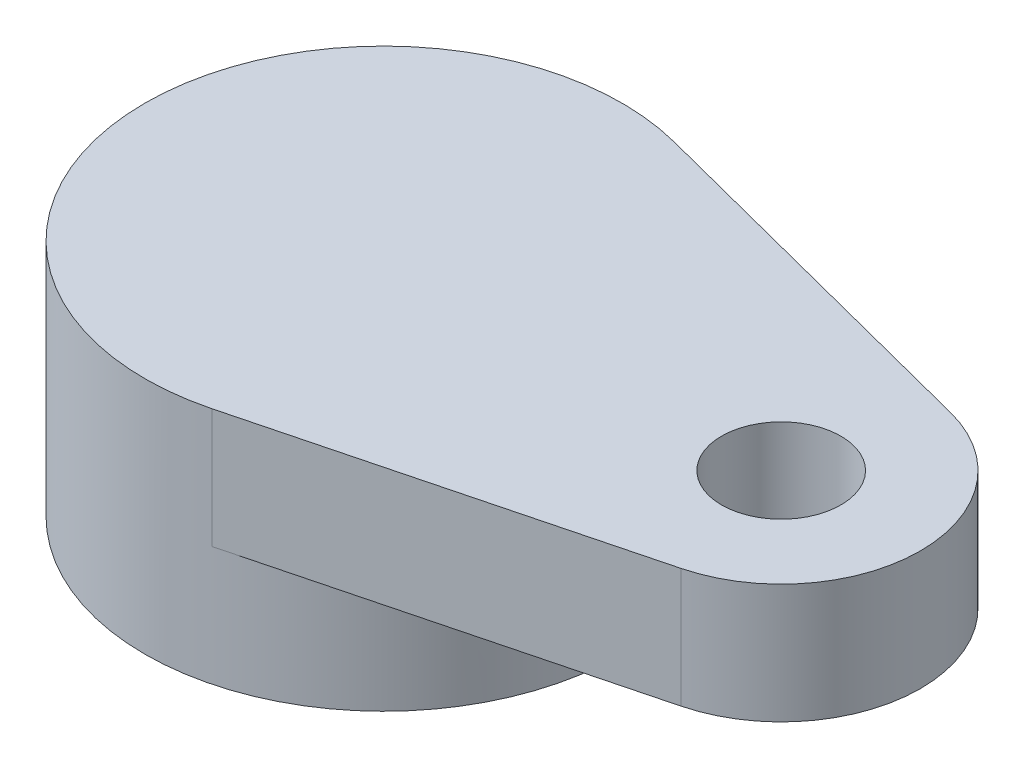
ISO-10303-21;
HEADER;
FILE_DESCRIPTION(('STEP AP214'),'2;1');
FILE_NAME('part.step','',(''),(''),'','','');
FILE_SCHEMA(('AUTOMOTIVE_DESIGN { 1 0 10303 214 1 1 1 1 }'));
ENDSEC;
DATA;
#1=APPLICATION_CONTEXT('core data for automotive mechanical design processes');
#2=APPLICATION_PROTOCOL_DEFINITION('international standard','automotive_design',2000,#1);
#3=PRODUCT_CONTEXT('',#1,'mechanical');
#4=PRODUCT('Part','Part','',(#3));
#5=PRODUCT_RELATED_PRODUCT_CATEGORY('part','',(#4));
#6=PRODUCT_DEFINITION_FORMATION('','',#4);
#7=PRODUCT_DEFINITION_CONTEXT('part definition',#1,'design');
#8=PRODUCT_DEFINITION('design','',#6,#7);
#9=PRODUCT_DEFINITION_SHAPE('','',#8);
#10=(LENGTH_UNIT() NAMED_UNIT(*) SI_UNIT(.MILLI.,.METRE.));
#11=(NAMED_UNIT(*) PLANE_ANGLE_UNIT() SI_UNIT($,.RADIAN.));
#12=(NAMED_UNIT(*) SI_UNIT($,.STERADIAN.) SOLID_ANGLE_UNIT());
#13=UNCERTAINTY_MEASURE_WITH_UNIT(LENGTH_MEASURE(1.E-05),#10,'distance_accuracy_value','');
#14=(GEOMETRIC_REPRESENTATION_CONTEXT(3) GLOBAL_UNCERTAINTY_ASSIGNED_CONTEXT((#13)) GLOBAL_UNIT_ASSIGNED_CONTEXT((#10,
#11,#12)) REPRESENTATION_CONTEXT('',''));
#15=CARTESIAN_POINT('',(0.,0.,0.));
#16=DIRECTION('',(0.,0.,1.));
#17=DIRECTION('',(1.,0.,0.));
#18=AXIS2_PLACEMENT_3D('',#15,#16,#17);
#19=CARTESIAN_POINT('',(0.,3.,0.));
#20=DIRECTION('',(0.,-1.,0.));
#21=DIRECTION('',(0.,0.,-1.));
#22=AXIS2_PLACEMENT_3D('',#19,#20,#21);
#23=CYLINDRICAL_SURFACE('',#22,3.);
#24=CARTESIAN_POINT('',(0.,0.,0.));
#25=DIRECTION('',(0.,1.,0.));
#26=DIRECTION('',(0.,0.,1.));
#27=AXIS2_PLACEMENT_3D('',#24,#25,#26);
#28=CIRCLE('',#27,3.);
#29=CARTESIAN_POINT('',(0.,0.,3.));
#30=VERTEX_POINT('',#29);
#31=EDGE_CURVE('E44',#30,#30,#28,.T.);
#32=ORIENTED_EDGE('',*,*,#31,.T.);
#33=EDGE_LOOP('',(#32));
#34=FACE_BOUND('',#33,.T.);
#35=DIRECTION('',(0.,1.,0.));
#36=VECTOR('',#35,1.);
#37=CARTESIAN_POINT('',(0.750000000000001,1.5,2.90473750965556));
#38=LINE('',#37,#36);
#39=CARTESIAN_POINT('',(0.750000000000001,1.5,2.90473750965556));
#40=VERTEX_POINT('',#39);
#41=CARTESIAN_POINT('',(0.750000000000001,3.,2.90473750965556));
#42=VERTEX_POINT('',#41);
#43=EDGE_CURVE('E127',#40,#42,#38,.T.);
#44=ORIENTED_EDGE('',*,*,#43,.T.);
#45=CARTESIAN_POINT('',(0.,3.,0.));
#46=DIRECTION('',(0.,1.,0.));
#47=DIRECTION('',(0.,0.,1.));
#48=AXIS2_PLACEMENT_3D('',#45,#46,#47);
#49=CIRCLE('',#48,3.);
#50=CARTESIAN_POINT('',(0.750000000000001,3.,-2.90473750965556));
#51=VERTEX_POINT('',#50);
#52=EDGE_CURVE('E11',#51,#42,#49,.T.);
#53=ORIENTED_EDGE('',*,*,#52,.F.);
#54=DIRECTION('',(0.,1.,0.));
#55=VECTOR('',#54,1.);
#56=CARTESIAN_POINT('',(0.750000000000001,1.5,-2.90473750965556));
#57=LINE('',#56,#55);
#58=CARTESIAN_POINT('',(0.750000000000001,1.5,-2.90473750965556));
#59=VERTEX_POINT('',#58);
#60=EDGE_CURVE('E103',#59,#51,#57,.T.);
#61=ORIENTED_EDGE('',*,*,#60,.F.);
#62=CARTESIAN_POINT('',(0.,1.5,0.));
#63=DIRECTION('',(0.,1.,0.));
#64=DIRECTION('',(0.,0.,1.));
#65=AXIS2_PLACEMENT_3D('',#62,#63,#64);
#66=CIRCLE('',#65,3.);
#67=EDGE_CURVE('E95',#40,#59,#66,.T.);
#68=ORIENTED_EDGE('',*,*,#67,.F.);
#69=EDGE_LOOP('',(#44,#53,#61,#68));
#70=FACE_BOUND('',#69,.T.);
#71=ADVANCED_FACE('F41',(#34,#70),#23,.T.);
#72=CARTESIAN_POINT('',(0.,3.,0.));
#73=DIRECTION('',(0.,1.,0.));
#74=DIRECTION('',(0.,0.,1.));
#75=AXIS2_PLACEMENT_3D('',#72,#73,#74);
#76=PLANE('',#75);
#77=ORIENTED_EDGE('',*,*,#52,.T.);
#78=DIRECTION('',(-0.968245836551854,0.,0.25));
#79=VECTOR('',#78,1.);
#80=CARTESIAN_POINT('',(0.750000000000001,3.,2.90473750965556));
#81=LINE('',#80,#79);
#82=CARTESIAN_POINT('',(5.4375,3.,1.69443021396575));
#83=VERTEX_POINT('',#82);
#84=EDGE_CURVE('E80',#83,#42,#81,.T.);
#85=ORIENTED_EDGE('',*,*,#84,.F.);
#86=CARTESIAN_POINT('',(5.,3.,0.));
#87=DIRECTION('',(0.,1.,0.));
#88=DIRECTION('',(0.,0.,1.));
#89=AXIS2_PLACEMENT_3D('',#86,#87,#88);
#90=CIRCLE('',#89,1.75);
#91=CARTESIAN_POINT('',(5.4375,3.,-1.69443021396574));
#92=VERTEX_POINT('',#91);
#93=EDGE_CURVE('E122',#83,#92,#90,.T.);
#94=ORIENTED_EDGE('',*,*,#93,.T.);
#95=DIRECTION('',(0.968245836551854,0.,0.25));
#96=VECTOR('',#95,1.);
#97=CARTESIAN_POINT('',(0.750000000000001,3.,-2.90473750965556));
#98=LINE('',#97,#96);
#99=EDGE_CURVE('E55',#51,#92,#98,.T.);
#100=ORIENTED_EDGE('',*,*,#99,.F.);
#101=EDGE_LOOP('',(#77,#85,#94,#100));
#102=FACE_BOUND('',#101,.T.);
#103=CARTESIAN_POINT('',(5.,3.,0.));
#104=DIRECTION('',(0.,1.,0.));
#105=DIRECTION('',(0.,0.,1.));
#106=AXIS2_PLACEMENT_3D('',#103,#104,#105);
#107=CIRCLE('',#106,0.750000000000002);
#108=CARTESIAN_POINT('',(5.,3.,0.750000000000002));
#109=VERTEX_POINT('',#108);
#110=EDGE_CURVE('E115',#109,#109,#107,.T.);
#111=ORIENTED_EDGE('',*,*,#110,.F.);
#112=EDGE_LOOP('',(#111));
#113=FACE_BOUND('',#112,.T.);
#114=ADVANCED_FACE('F134',(#102,#113),#76,.T.);
#115=CARTESIAN_POINT('',(0.,0.,0.));
#116=DIRECTION('',(0.,1.,0.));
#117=DIRECTION('',(0.,0.,1.));
#118=AXIS2_PLACEMENT_3D('',#115,#116,#117);
#119=PLANE('',#118);
#120=CARTESIAN_POINT('',(0.,0.,0.));
#121=DIRECTION('',(0.,-1.,0.));
#122=DIRECTION('',(0.,0.,-1.));
#123=AXIS2_PLACEMENT_3D('',#120,#121,#122);
#124=CIRCLE('',#123,2.4);
#125=CARTESIAN_POINT('',(0.,0.,-2.4));
#126=VERTEX_POINT('',#125);
#127=EDGE_CURVE('E180',#126,#126,#124,.T.);
#128=ORIENTED_EDGE('',*,*,#127,.F.);
#129=EDGE_LOOP('',(#128));
#130=FACE_BOUND('',#129,.T.);
#131=ORIENTED_EDGE('',*,*,#31,.F.);
#132=EDGE_LOOP('',(#131));
#133=FACE_BOUND('',#132,.T.);
#134=ADVANCED_FACE('F143',(#130,#133),#119,.F.);
#135=CARTESIAN_POINT('',(0.750000000000001,1.5,2.90473750965556));
#136=DIRECTION('',(-0.25,0.,-0.968245836551854));
#137=DIRECTION('',(-0.968245836551854,0.,0.25));
#138=AXIS2_PLACEMENT_3D('',#135,#136,#137);
#139=PLANE('',#138);
#140=ORIENTED_EDGE('',*,*,#84,.T.);
#141=ORIENTED_EDGE('',*,*,#43,.F.);
#142=DIRECTION('',(-0.968245836551854,0.,0.25));
#143=VECTOR('',#142,1.);
#144=CARTESIAN_POINT('',(0.750000000000001,1.5,2.90473750965556));
#145=LINE('',#144,#143);
#146=CARTESIAN_POINT('',(5.4375,1.5,1.69443021396575));
#147=VERTEX_POINT('',#146);
#148=EDGE_CURVE('E64',#147,#40,#145,.T.);
#149=ORIENTED_EDGE('',*,*,#148,.F.);
#150=DIRECTION('',(0.,1.,0.));
#151=VECTOR('',#150,1.);
#152=CARTESIAN_POINT('',(5.4375,1.5,1.69443021396575));
#153=LINE('',#152,#151);
#154=EDGE_CURVE('E87',#147,#83,#153,.T.);
#155=ORIENTED_EDGE('',*,*,#154,.T.);
#156=EDGE_LOOP('',(#140,#141,#149,#155));
#157=FACE_BOUND('',#156,.T.);
#158=ADVANCED_FACE('F133',(#157),#139,.F.);
#159=CARTESIAN_POINT('',(0.750000000000001,1.5,-2.90473750965556));
#160=DIRECTION('',(-0.25,0.,0.968245836551854));
#161=DIRECTION('',(0.968245836551854,0.,0.25));
#162=AXIS2_PLACEMENT_3D('',#159,#160,#161);
#163=PLANE('',#162);
#164=ORIENTED_EDGE('',*,*,#99,.T.);
#165=DIRECTION('',(0.,1.,0.));
#166=VECTOR('',#165,1.);
#167=CARTESIAN_POINT('',(5.4375,1.5,-1.69443021396574));
#168=LINE('',#167,#166);
#169=CARTESIAN_POINT('',(5.4375,1.5,-1.69443021396574));
#170=VERTEX_POINT('',#169);
#171=EDGE_CURVE('E100',#170,#92,#168,.T.);
#172=ORIENTED_EDGE('',*,*,#171,.F.);
#173=DIRECTION('',(0.968245836551854,0.,0.25));
#174=VECTOR('',#173,1.);
#175=CARTESIAN_POINT('',(0.750000000000001,1.5,-2.90473750965556));
#176=LINE('',#175,#174);
#177=EDGE_CURVE('E90',#59,#170,#176,.T.);
#178=ORIENTED_EDGE('',*,*,#177,.F.);
#179=ORIENTED_EDGE('',*,*,#60,.T.);
#180=EDGE_LOOP('',(#164,#172,#178,#179));
#181=FACE_BOUND('',#180,.T.);
#182=ADVANCED_FACE('F101',(#181),#163,.F.);
#183=CARTESIAN_POINT('',(5.,1.5,0.));
#184=DIRECTION('',(0.,1.,0.));
#185=DIRECTION('',(0.,0.,1.));
#186=AXIS2_PLACEMENT_3D('',#183,#184,#185);
#187=CYLINDRICAL_SURFACE('',#186,0.750000000000002);
#188=CARTESIAN_POINT('',(5.,1.5,0.));
#189=DIRECTION('',(0.,1.,0.));
#190=DIRECTION('',(0.,0.,1.));
#191=AXIS2_PLACEMENT_3D('',#188,#189,#190);
#192=CIRCLE('',#191,0.750000000000002);
#193=CARTESIAN_POINT('',(5.,1.5,0.750000000000002));
#194=VERTEX_POINT('',#193);
#195=EDGE_CURVE('E109',#194,#194,#192,.T.);
#196=ORIENTED_EDGE('',*,*,#195,.F.);
#197=EDGE_LOOP('',(#196));
#198=FACE_BOUND('',#197,.T.);
#199=ORIENTED_EDGE('',*,*,#110,.T.);
#200=EDGE_LOOP('',(#199));
#201=FACE_BOUND('',#200,.T.);
#202=ADVANCED_FACE('F157',(#198,#201),#187,.F.);
#203=CARTESIAN_POINT('',(5.,1.5,0.));
#204=DIRECTION('',(0.,1.,0.));
#205=DIRECTION('',(0.,0.,1.));
#206=AXIS2_PLACEMENT_3D('',#203,#204,#205);
#207=CYLINDRICAL_SURFACE('',#206,1.75);
#208=ORIENTED_EDGE('',*,*,#93,.F.);
#209=ORIENTED_EDGE('',*,*,#154,.F.);
#210=CARTESIAN_POINT('',(5.,1.5,0.));
#211=DIRECTION('',(0.,1.,0.));
#212=DIRECTION('',(0.,0.,1.));
#213=AXIS2_PLACEMENT_3D('',#210,#211,#212);
#214=CIRCLE('',#213,1.75);
#215=EDGE_CURVE('E93',#147,#170,#214,.T.);
#216=ORIENTED_EDGE('',*,*,#215,.T.);
#217=ORIENTED_EDGE('',*,*,#171,.T.);
#218=EDGE_LOOP('',(#208,#209,#216,#217));
#219=FACE_BOUND('',#218,.T.);
#220=ADVANCED_FACE('F105',(#219),#207,.T.);
#221=CARTESIAN_POINT('',(0.,1.5,0.));
#222=DIRECTION('',(0.,1.,0.));
#223=DIRECTION('',(0.,0.,1.));
#224=AXIS2_PLACEMENT_3D('',#221,#222,#223);
#225=PLANE('',#224);
#226=ORIENTED_EDGE('',*,*,#195,.T.);
#227=EDGE_LOOP('',(#226));
#228=FACE_BOUND('',#227,.T.);
#229=ORIENTED_EDGE('',*,*,#148,.T.);
#230=ORIENTED_EDGE('',*,*,#67,.T.);
#231=ORIENTED_EDGE('',*,*,#177,.T.);
#232=ORIENTED_EDGE('',*,*,#215,.F.);
#233=EDGE_LOOP('',(#229,#230,#231,#232));
#234=FACE_BOUND('',#233,.T.);
#235=ADVANCED_FACE('F92',(#228,#234),#225,.F.);
#236=CARTESIAN_POINT('',(0.,2.,0.));
#237=DIRECTION('',(0.,-1.,0.));
#238=DIRECTION('',(0.,0.,-1.));
#239=AXIS2_PLACEMENT_3D('',#236,#237,#238);
#240=CYLINDRICAL_SURFACE('',#239,2.4);
#241=CARTESIAN_POINT('',(0.,2.,0.));
#242=DIRECTION('',(0.,-1.,0.));
#243=DIRECTION('',(0.,0.,-1.));
#244=AXIS2_PLACEMENT_3D('',#241,#242,#243);
#245=CIRCLE('',#244,2.4);
#246=CARTESIAN_POINT('',(0.,2.,-2.4));
#247=VERTEX_POINT('',#246);
#248=EDGE_CURVE('E119',#247,#247,#245,.T.);
#249=ORIENTED_EDGE('',*,*,#248,.F.);
#250=EDGE_LOOP('',(#249));
#251=FACE_BOUND('',#250,.T.);
#252=ORIENTED_EDGE('',*,*,#127,.T.);
#253=EDGE_LOOP('',(#252));
#254=FACE_BOUND('',#253,.T.);
#255=ADVANCED_FACE('F167',(#251,#254),#240,.F.);
#256=CARTESIAN_POINT('',(0.,2.,0.));
#257=DIRECTION('',(0.,-1.,0.));
#258=DIRECTION('',(0.,0.,-1.));
#259=AXIS2_PLACEMENT_3D('',#256,#257,#258);
#260=PLANE('',#259);
#261=ORIENTED_EDGE('',*,*,#248,.T.);
#262=EDGE_LOOP('',(#261));
#263=FACE_BOUND('',#262,.T.);
#264=ADVANCED_FACE('F171',(#263),#260,.T.);
#265=CLOSED_SHELL('',(#71,#114,#134,#158,#182,#202,#220,#235,#255,#264));
#266=MANIFOLD_SOLID_BREP('B2',#265);
#267=ADVANCED_BREP_SHAPE_REPRESENTATION('',(#18,#266),#14);
#268=SHAPE_DEFINITION_REPRESENTATION(#9,#267);
ENDSEC;
END-ISO-10303-21;
